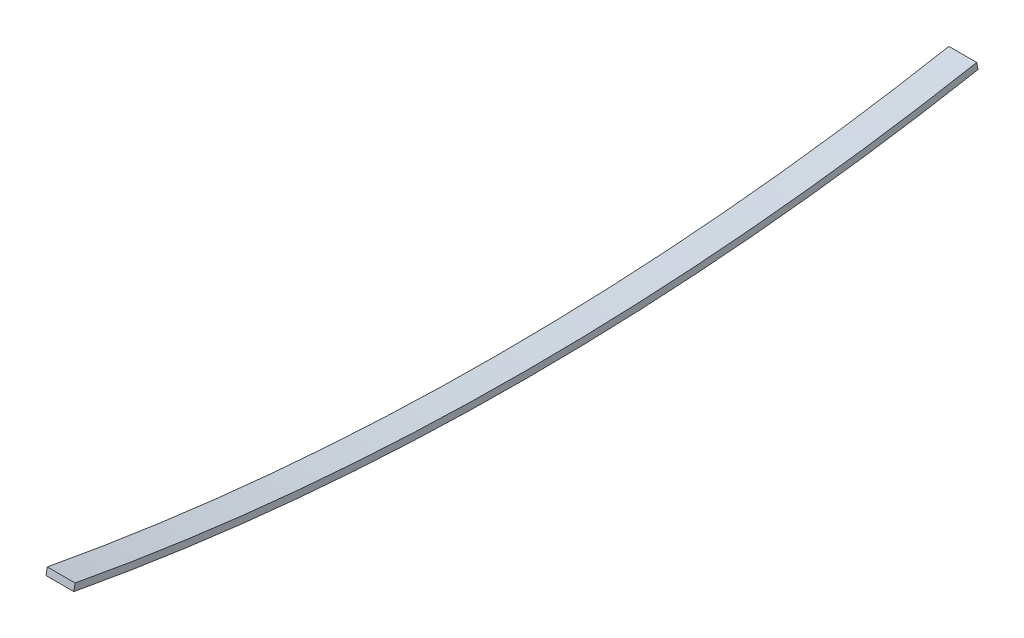
ISO-10303-21;
HEADER;
FILE_DESCRIPTION(('STEP AP214'),'2;1');
FILE_NAME('part.step','',(''),(''),'','','');
FILE_SCHEMA(('AUTOMOTIVE_DESIGN { 1 0 10303 214 1 1 1 1 }'));
ENDSEC;
DATA;
#1=APPLICATION_CONTEXT('core data for automotive mechanical design processes');
#2=APPLICATION_PROTOCOL_DEFINITION('international standard','automotive_design',2000,#1);
#3=PRODUCT_CONTEXT('',#1,'mechanical');
#4=PRODUCT('Part','Part','',(#3));
#5=PRODUCT_RELATED_PRODUCT_CATEGORY('part','',(#4));
#6=PRODUCT_DEFINITION_FORMATION('','',#4);
#7=PRODUCT_DEFINITION_CONTEXT('part definition',#1,'design');
#8=PRODUCT_DEFINITION('design','',#6,#7);
#9=PRODUCT_DEFINITION_SHAPE('','',#8);
#10=(LENGTH_UNIT() NAMED_UNIT(*) SI_UNIT(.MILLI.,.METRE.));
#11=(NAMED_UNIT(*) PLANE_ANGLE_UNIT() SI_UNIT($,.RADIAN.));
#12=(NAMED_UNIT(*) SI_UNIT($,.STERADIAN.) SOLID_ANGLE_UNIT());
#13=UNCERTAINTY_MEASURE_WITH_UNIT(LENGTH_MEASURE(1.E-05),#10,'distance_accuracy_value','');
#14=(GEOMETRIC_REPRESENTATION_CONTEXT(3) GLOBAL_UNCERTAINTY_ASSIGNED_CONTEXT((#13)) GLOBAL_UNIT_ASSIGNED_CONTEXT((#10,
#11,#12)) REPRESENTATION_CONTEXT('',''));
#15=CARTESIAN_POINT('',(0.,0.,0.));
#16=DIRECTION('',(0.,0.,1.));
#17=DIRECTION('',(1.,0.,0.));
#18=AXIS2_PLACEMENT_3D('',#15,#16,#17);
#19=CARTESIAN_POINT('',(2.,176.04166666667,0.));
#20=DIRECTION('',(-1.,0.,0.));
#21=DIRECTION('',(0.,0.,1.));
#22=AXIS2_PLACEMENT_3D('',#19,#20,#21);
#23=CYLINDRICAL_SURFACE('',#22,177.54166666667);
#24=CARTESIAN_POINT('',(0.,176.04166666667,0.));
#25=DIRECTION('',(1.,0.,0.));
#26=DIRECTION('',(0.,0.,-1.));
#27=AXIS2_PLACEMENT_3D('',#24,#25,#26);
#28=CIRCLE('',#27,177.54166666667);
#29=CARTESIAN_POINT('',(0.,1.5,32.5));
#30=VERTEX_POINT('',#29);
#31=CARTESIAN_POINT('',(0.,1.5,-32.4999999999999));
#32=VERTEX_POINT('',#31);
#33=EDGE_CURVE('E95',#30,#32,#28,.T.);
#34=ORIENTED_EDGE('',*,*,#33,.T.);
#35=DIRECTION('',(-1.,0.,0.));
#36=VECTOR('',#35,1.);
#37=CARTESIAN_POINT('',(2.,1.5,-32.4999999999999));
#38=LINE('',#37,#36);
#39=CARTESIAN_POINT('',(2.,1.5,-32.4999999999999));
#40=VERTEX_POINT('',#39);
#41=EDGE_CURVE('E11',#40,#32,#38,.T.);
#42=ORIENTED_EDGE('',*,*,#41,.F.);
#43=CARTESIAN_POINT('',(2.,176.04166666667,0.));
#44=DIRECTION('',(1.,0.,0.));
#45=DIRECTION('',(0.,0.,-1.));
#46=AXIS2_PLACEMENT_3D('',#43,#44,#45);
#47=CIRCLE('',#46,177.54166666667);
#48=CARTESIAN_POINT('',(2.,1.5,32.5));
#49=VERTEX_POINT('',#48);
#50=EDGE_CURVE('E72',#49,#40,#47,.T.);
#51=ORIENTED_EDGE('',*,*,#50,.F.);
#52=DIRECTION('',(-1.,0.,0.));
#53=VECTOR('',#52,1.);
#54=CARTESIAN_POINT('',(2.,1.5,32.5));
#55=LINE('',#54,#53);
#56=EDGE_CURVE('E48',#49,#30,#55,.T.);
#57=ORIENTED_EDGE('',*,*,#56,.T.);
#58=EDGE_LOOP('',(#34,#42,#51,#57));
#59=FACE_BOUND('',#58,.T.);
#60=ADVANCED_FACE('F32',(#59),#23,.T.);
#61=CARTESIAN_POINT('',(2.,1.99155127904249,-32.4084721896268));
#62=DIRECTION('',(0.,0.183055620746299,-0.983102558084958));
#63=DIRECTION('',(0.,0.983102558084958,0.183055620746299));
#64=AXIS2_PLACEMENT_3D('',#61,#62,#63);
#65=PLANE('',#64);
#66=DIRECTION('',(0.,-0.983102558084958,-0.183055620746299));
#67=VECTOR('',#66,1.);
#68=CARTESIAN_POINT('',(0.,1.99155127904249,-32.4084721896268));
#69=LINE('',#68,#67);
#70=CARTESIAN_POINT('',(0.,1.99155127904249,-32.4084721896268));
#71=VERTEX_POINT('',#70);
#72=EDGE_CURVE('E81',#71,#32,#69,.T.);
#73=ORIENTED_EDGE('',*,*,#72,.F.);
#74=DIRECTION('',(-1.,0.,0.));
#75=VECTOR('',#74,1.);
#76=CARTESIAN_POINT('',(2.,1.99155127904249,-32.4084721896268));
#77=LINE('',#76,#75);
#78=CARTESIAN_POINT('',(2.,1.99155127904249,-32.4084721896268));
#79=VERTEX_POINT('',#78);
#80=EDGE_CURVE('E40',#79,#71,#77,.T.);
#81=ORIENTED_EDGE('',*,*,#80,.F.);
#82=DIRECTION('',(0.,-0.983102558084958,-0.183055620746299));
#83=VECTOR('',#82,1.);
#84=CARTESIAN_POINT('',(2.,1.99155127904249,-32.4084721896268));
#85=LINE('',#84,#83);
#86=EDGE_CURVE('E79',#79,#40,#85,.T.);
#87=ORIENTED_EDGE('',*,*,#86,.T.);
#88=ORIENTED_EDGE('',*,*,#41,.T.);
#89=EDGE_LOOP('',(#73,#81,#87,#88));
#90=FACE_BOUND('',#89,.T.);
#91=ADVANCED_FACE('F78',(#90),#65,.T.);
#92=CARTESIAN_POINT('',(2.,176.04166666667,0.));
#93=DIRECTION('',(-1.,0.,0.));
#94=DIRECTION('',(0.,0.,1.));
#95=AXIS2_PLACEMENT_3D('',#92,#93,#94);
#96=CYLINDRICAL_SURFACE('',#95,177.04166666667);
#97=CARTESIAN_POINT('',(0.,176.04166666667,0.));
#98=DIRECTION('',(1.,0.,0.));
#99=DIRECTION('',(0.,0.,-1.));
#100=AXIS2_PLACEMENT_3D('',#97,#98,#99);
#101=CIRCLE('',#100,177.04166666667);
#102=CARTESIAN_POINT('',(0.,1.99155127904249,32.4084721896269));
#103=VERTEX_POINT('',#102);
#104=EDGE_CURVE('E98',#103,#71,#101,.T.);
#105=ORIENTED_EDGE('',*,*,#104,.F.);
#106=DIRECTION('',(-1.,0.,0.));
#107=VECTOR('',#106,1.);
#108=CARTESIAN_POINT('',(2.,1.99155127904249,32.4084721896269));
#109=LINE('',#108,#107);
#110=CARTESIAN_POINT('',(2.,1.99155127904249,32.4084721896269));
#111=VERTEX_POINT('',#110);
#112=EDGE_CURVE('E61',#111,#103,#109,.T.);
#113=ORIENTED_EDGE('',*,*,#112,.F.);
#114=CARTESIAN_POINT('',(2.,176.04166666667,0.));
#115=DIRECTION('',(1.,0.,0.));
#116=DIRECTION('',(0.,0.,-1.));
#117=AXIS2_PLACEMENT_3D('',#114,#115,#116);
#118=CIRCLE('',#117,177.04166666667);
#119=EDGE_CURVE('E87',#111,#79,#118,.T.);
#120=ORIENTED_EDGE('',*,*,#119,.T.);
#121=ORIENTED_EDGE('',*,*,#80,.T.);
#122=EDGE_LOOP('',(#105,#113,#120,#121));
#123=FACE_BOUND('',#122,.T.);
#124=ADVANCED_FACE('F89',(#123),#96,.F.);
#125=CARTESIAN_POINT('',(2.,1.5,32.5));
#126=DIRECTION('',(0.,0.183055620746299,0.983102558084958));
#127=DIRECTION('',(0.,-0.983102558084958,0.183055620746299));
#128=AXIS2_PLACEMENT_3D('',#125,#126,#127);
#129=PLANE('',#128);
#130=DIRECTION('',(0.,0.983102558084958,-0.183055620746299));
#131=VECTOR('',#130,1.);
#132=CARTESIAN_POINT('',(0.,1.5,32.5));
#133=LINE('',#132,#131);
#134=EDGE_CURVE('E100',#30,#103,#133,.T.);
#135=ORIENTED_EDGE('',*,*,#134,.F.);
#136=ORIENTED_EDGE('',*,*,#56,.F.);
#137=DIRECTION('',(0.,0.983102558084958,-0.183055620746299));
#138=VECTOR('',#137,1.);
#139=CARTESIAN_POINT('',(2.,1.5,32.5));
#140=LINE('',#139,#138);
#141=EDGE_CURVE('E90',#49,#111,#140,.T.);
#142=ORIENTED_EDGE('',*,*,#141,.T.);
#143=ORIENTED_EDGE('',*,*,#112,.T.);
#144=EDGE_LOOP('',(#135,#136,#142,#143));
#145=FACE_BOUND('',#144,.T.);
#146=ADVANCED_FACE('F106',(#145),#129,.T.);
#147=CARTESIAN_POINT('',(2.,176.04166666667,0.));
#148=DIRECTION('',(1.,0.,0.));
#149=DIRECTION('',(0.,0.,-1.));
#150=AXIS2_PLACEMENT_3D('',#147,#148,#149);
#151=PLANE('',#150);
#152=ORIENTED_EDGE('',*,*,#50,.T.);
#153=ORIENTED_EDGE('',*,*,#86,.F.);
#154=ORIENTED_EDGE('',*,*,#119,.F.);
#155=ORIENTED_EDGE('',*,*,#141,.F.);
#156=EDGE_LOOP('',(#152,#153,#154,#155));
#157=FACE_BOUND('',#156,.T.);
#158=ADVANCED_FACE('F86',(#157),#151,.T.);
#159=CARTESIAN_POINT('',(0.,176.04166666667,0.));
#160=DIRECTION('',(1.,0.,0.));
#161=DIRECTION('',(0.,0.,-1.));
#162=AXIS2_PLACEMENT_3D('',#159,#160,#161);
#163=PLANE('',#162);
#164=ORIENTED_EDGE('',*,*,#33,.F.);
#165=ORIENTED_EDGE('',*,*,#134,.T.);
#166=ORIENTED_EDGE('',*,*,#104,.T.);
#167=ORIENTED_EDGE('',*,*,#72,.T.);
#168=EDGE_LOOP('',(#164,#165,#166,#167));
#169=FACE_BOUND('',#168,.T.);
#170=ADVANCED_FACE('F105',(#169),#163,.F.);
#171=CLOSED_SHELL('',(#60,#91,#124,#146,#158,#170));
#172=MANIFOLD_SOLID_BREP('B2',#171);
#173=ADVANCED_BREP_SHAPE_REPRESENTATION('',(#18,#172),#14);
#174=SHAPE_DEFINITION_REPRESENTATION(#9,#173);
ENDSEC;
END-ISO-10303-21;
